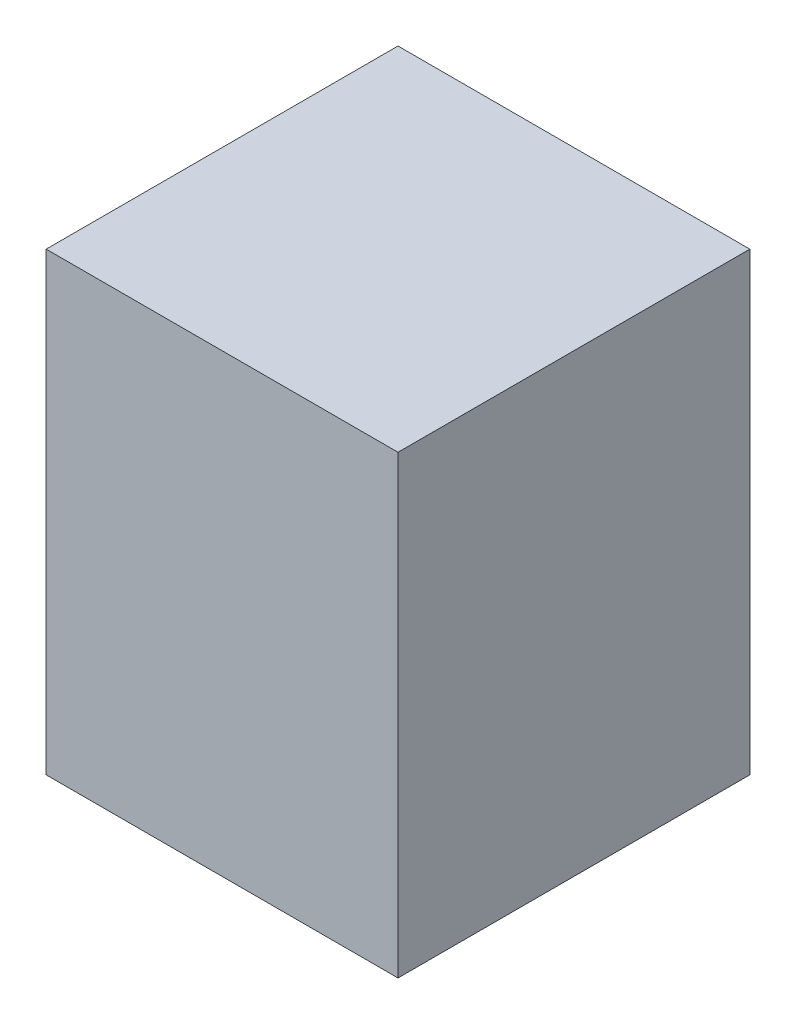
ISO-10303-21;
HEADER;
FILE_DESCRIPTION(('STEP AP214'),'2;1');
FILE_NAME('part.step','',(''),(''),'','','');
FILE_SCHEMA(('AUTOMOTIVE_DESIGN { 1 0 10303 214 1 1 1 1 }'));
ENDSEC;
DATA;
#1=APPLICATION_CONTEXT('core data for automotive mechanical design processes');
#2=APPLICATION_PROTOCOL_DEFINITION('international standard','automotive_design',2000,#1);
#3=PRODUCT_CONTEXT('',#1,'mechanical');
#4=PRODUCT('Part','Part','',(#3));
#5=PRODUCT_RELATED_PRODUCT_CATEGORY('part','',(#4));
#6=PRODUCT_DEFINITION_FORMATION('','',#4);
#7=PRODUCT_DEFINITION_CONTEXT('part definition',#1,'design');
#8=PRODUCT_DEFINITION('design','',#6,#7);
#9=PRODUCT_DEFINITION_SHAPE('','',#8);
#10=(LENGTH_UNIT() NAMED_UNIT(*) SI_UNIT(.MILLI.,.METRE.));
#11=(NAMED_UNIT(*) PLANE_ANGLE_UNIT() SI_UNIT($,.RADIAN.));
#12=(NAMED_UNIT(*) SI_UNIT($,.STERADIAN.) SOLID_ANGLE_UNIT());
#13=UNCERTAINTY_MEASURE_WITH_UNIT(LENGTH_MEASURE(1.E-05),#10,'distance_accuracy_value','');
#14=(GEOMETRIC_REPRESENTATION_CONTEXT(3) GLOBAL_UNCERTAINTY_ASSIGNED_CONTEXT((#13)) GLOBAL_UNIT_ASSIGNED_CONTEXT((#10,
#11,#12)) REPRESENTATION_CONTEXT('',''));
#15=CARTESIAN_POINT('',(0.,0.,0.));
#16=DIRECTION('',(0.,0.,1.));
#17=DIRECTION('',(1.,0.,0.));
#18=AXIS2_PLACEMENT_3D('',#15,#16,#17);
#19=CARTESIAN_POINT('',(0.,0.,0.));
#20=DIRECTION('',(0.,-1.,0.));
#21=DIRECTION('',(0.,0.,-1.));
#22=AXIS2_PLACEMENT_3D('',#19,#20,#21);
#23=PLANE('',#22);
#24=DIRECTION('',(0.,0.,-1.));
#25=VECTOR('',#24,1.);
#26=CARTESIAN_POINT('',(2590.8,0.,2590.8));
#27=LINE('',#26,#25);
#28=CARTESIAN_POINT('',(2590.8,0.,2590.8));
#29=VERTEX_POINT('',#28);
#30=CARTESIAN_POINT('',(2590.8,0.,-2590.8));
#31=VERTEX_POINT('',#30);
#32=EDGE_CURVE('E131',#29,#31,#27,.T.);
#33=ORIENTED_EDGE('',*,*,#32,.F.);
#34=DIRECTION('',(1.,0.,0.));
#35=VECTOR('',#34,1.);
#36=CARTESIAN_POINT('',(-2590.8,0.,2590.8));
#37=LINE('',#36,#35);
#38=CARTESIAN_POINT('',(-2590.8,0.,2590.8));
#39=VERTEX_POINT('',#38);
#40=EDGE_CURVE('E79',#39,#29,#37,.T.);
#41=ORIENTED_EDGE('',*,*,#40,.F.);
#42=DIRECTION('',(0.,0.,1.));
#43=VECTOR('',#42,1.);
#44=CARTESIAN_POINT('',(-2590.8,0.,2590.8));
#45=LINE('',#44,#43);
#46=CARTESIAN_POINT('',(-2590.8,0.,-2590.8));
#47=VERTEX_POINT('',#46);
#48=EDGE_CURVE('E159',#47,#39,#45,.T.);
#49=ORIENTED_EDGE('',*,*,#48,.F.);
#50=DIRECTION('',(-1.,0.,0.));
#51=VECTOR('',#50,1.);
#52=CARTESIAN_POINT('',(-2590.8,0.,-2590.8));
#53=LINE('',#52,#51);
#54=EDGE_CURVE('E135',#31,#47,#53,.T.);
#55=ORIENTED_EDGE('',*,*,#54,.F.);
#56=EDGE_LOOP('',(#33,#41,#49,#55));
#57=FACE_BOUND('',#56,.T.);
#58=DIRECTION('',(1.,0.,0.));
#59=VECTOR('',#58,1.);
#60=CARTESIAN_POINT('',(0.,0.,2286.));
#61=LINE('',#60,#59);
#62=CARTESIAN_POINT('',(-2286.,0.,2286.));
#63=VERTEX_POINT('',#62);
#64=CARTESIAN_POINT('',(2286.,0.,2286.));
#65=VERTEX_POINT('',#64);
#66=EDGE_CURVE('E126',#63,#65,#61,.T.);
#67=ORIENTED_EDGE('',*,*,#66,.T.);
#68=DIRECTION('',(0.,0.,-1.));
#69=VECTOR('',#68,1.);
#70=CARTESIAN_POINT('',(2286.,0.,0.));
#71=LINE('',#70,#69);
#72=CARTESIAN_POINT('',(2286.,0.,-2286.));
#73=VERTEX_POINT('',#72);
#74=EDGE_CURVE('E145',#65,#73,#71,.T.);
#75=ORIENTED_EDGE('',*,*,#74,.T.);
#76=DIRECTION('',(-1.,0.,0.));
#77=VECTOR('',#76,1.);
#78=CARTESIAN_POINT('',(0.,0.,-2286.));
#79=LINE('',#78,#77);
#80=CARTESIAN_POINT('',(-2286.,0.,-2286.));
#81=VERTEX_POINT('',#80);
#82=EDGE_CURVE('E130',#73,#81,#79,.T.);
#83=ORIENTED_EDGE('',*,*,#82,.T.);
#84=DIRECTION('',(0.,0.,1.));
#85=VECTOR('',#84,1.);
#86=CARTESIAN_POINT('',(-2286.,0.,0.));
#87=LINE('',#86,#85);
#88=EDGE_CURVE('E49',#81,#63,#87,.T.);
#89=ORIENTED_EDGE('',*,*,#88,.T.);
#90=EDGE_LOOP('',(#67,#75,#83,#89));
#91=FACE_BOUND('',#90,.T.);
#92=ADVANCED_FACE('F34',(#57,#91),#23,.T.);
#93=CARTESIAN_POINT('',(2590.8,6705.6,2590.8));
#94=DIRECTION('',(-1.,0.,0.));
#95=DIRECTION('',(0.,0.,1.));
#96=AXIS2_PLACEMENT_3D('',#93,#94,#95);
#97=PLANE('',#96);
#98=ORIENTED_EDGE('',*,*,#32,.T.);
#99=DIRECTION('',(0.,-1.,0.));
#100=VECTOR('',#99,1.);
#101=CARTESIAN_POINT('',(2590.8,6705.6,-2590.8));
#102=LINE('',#101,#100);
#103=CARTESIAN_POINT('',(2590.8,6705.6,-2590.8));
#104=VERTEX_POINT('',#103);
#105=EDGE_CURVE('E11',#104,#31,#102,.T.);
#106=ORIENTED_EDGE('',*,*,#105,.F.);
#107=DIRECTION('',(0.,0.,-1.));
#108=VECTOR('',#107,1.);
#109=CARTESIAN_POINT('',(2590.8,6705.6,2590.8));
#110=LINE('',#109,#108);
#111=CARTESIAN_POINT('',(2590.8,6705.6,2590.8));
#112=VERTEX_POINT('',#111);
#113=EDGE_CURVE('E151',#112,#104,#110,.T.);
#114=ORIENTED_EDGE('',*,*,#113,.F.);
#115=DIRECTION('',(0.,-1.,0.));
#116=VECTOR('',#115,1.);
#117=CARTESIAN_POINT('',(2590.8,6705.6,2590.8));
#118=LINE('',#117,#116);
#119=EDGE_CURVE('E156',#112,#29,#118,.T.);
#120=ORIENTED_EDGE('',*,*,#119,.T.);
#121=EDGE_LOOP('',(#98,#106,#114,#120));
#122=FACE_BOUND('',#121,.T.);
#123=ADVANCED_FACE('F36',(#122),#97,.F.);
#124=CARTESIAN_POINT('',(-2590.8,6705.6,-2590.8));
#125=DIRECTION('',(0.,0.,1.));
#126=DIRECTION('',(1.,0.,0.));
#127=AXIS2_PLACEMENT_3D('',#124,#125,#126);
#128=PLANE('',#127);
#129=ORIENTED_EDGE('',*,*,#54,.T.);
#130=DIRECTION('',(0.,-1.,0.));
#131=VECTOR('',#130,1.);
#132=CARTESIAN_POINT('',(-2590.8,6705.6,-2590.8));
#133=LINE('',#132,#131);
#134=CARTESIAN_POINT('',(-2590.8,6705.6,-2590.8));
#135=VERTEX_POINT('',#134);
#136=EDGE_CURVE('E42',#135,#47,#133,.T.);
#137=ORIENTED_EDGE('',*,*,#136,.F.);
#138=DIRECTION('',(-1.,0.,0.));
#139=VECTOR('',#138,1.);
#140=CARTESIAN_POINT('',(-2590.8,6705.6,-2590.8));
#141=LINE('',#140,#139);
#142=EDGE_CURVE('E86',#104,#135,#141,.T.);
#143=ORIENTED_EDGE('',*,*,#142,.F.);
#144=ORIENTED_EDGE('',*,*,#105,.T.);
#145=EDGE_LOOP('',(#129,#137,#143,#144));
#146=FACE_BOUND('',#145,.T.);
#147=ADVANCED_FACE('F185',(#146),#128,.F.);
#148=CARTESIAN_POINT('',(-2590.8,6705.6,2590.8));
#149=DIRECTION('',(1.,0.,0.));
#150=DIRECTION('',(0.,0.,-1.));
#151=AXIS2_PLACEMENT_3D('',#148,#149,#150);
#152=PLANE('',#151);
#153=ORIENTED_EDGE('',*,*,#48,.T.);
#154=DIRECTION('',(0.,-1.,0.));
#155=VECTOR('',#154,1.);
#156=CARTESIAN_POINT('',(-2590.8,6705.6,2590.8));
#157=LINE('',#156,#155);
#158=CARTESIAN_POINT('',(-2590.8,6705.6,2590.8));
#159=VERTEX_POINT('',#158);
#160=EDGE_CURVE('E163',#159,#39,#157,.T.);
#161=ORIENTED_EDGE('',*,*,#160,.F.);
#162=DIRECTION('',(0.,0.,1.));
#163=VECTOR('',#162,1.);
#164=CARTESIAN_POINT('',(-2590.8,6705.6,2590.8));
#165=LINE('',#164,#163);
#166=EDGE_CURVE('E154',#135,#159,#165,.T.);
#167=ORIENTED_EDGE('',*,*,#166,.F.);
#168=ORIENTED_EDGE('',*,*,#136,.T.);
#169=EDGE_LOOP('',(#153,#161,#167,#168));
#170=FACE_BOUND('',#169,.T.);
#171=ADVANCED_FACE('F168',(#170),#152,.F.);
#172=CARTESIAN_POINT('',(-2590.8,6705.6,2590.8));
#173=DIRECTION('',(0.,0.,-1.));
#174=DIRECTION('',(-1.,0.,0.));
#175=AXIS2_PLACEMENT_3D('',#172,#173,#174);
#176=PLANE('',#175);
#177=ORIENTED_EDGE('',*,*,#40,.T.);
#178=ORIENTED_EDGE('',*,*,#119,.F.);
#179=DIRECTION('',(1.,0.,0.));
#180=VECTOR('',#179,1.);
#181=CARTESIAN_POINT('',(-2590.8,6705.6,2590.8));
#182=LINE('',#181,#180);
#183=EDGE_CURVE('E58',#159,#112,#182,.T.);
#184=ORIENTED_EDGE('',*,*,#183,.F.);
#185=ORIENTED_EDGE('',*,*,#160,.T.);
#186=EDGE_LOOP('',(#177,#178,#184,#185));
#187=FACE_BOUND('',#186,.T.);
#188=ADVANCED_FACE('F176',(#187),#176,.F.);
#189=CARTESIAN_POINT('',(0.,6705.6,0.));
#190=DIRECTION('',(0.,-1.,0.));
#191=DIRECTION('',(0.,0.,-1.));
#192=AXIS2_PLACEMENT_3D('',#189,#190,#191);
#193=PLANE('',#192);
#194=ORIENTED_EDGE('',*,*,#113,.T.);
#195=ORIENTED_EDGE('',*,*,#142,.T.);
#196=ORIENTED_EDGE('',*,*,#166,.T.);
#197=ORIENTED_EDGE('',*,*,#183,.T.);
#198=EDGE_LOOP('',(#194,#195,#196,#197));
#199=FACE_BOUND('',#198,.T.);
#200=ADVANCED_FACE('F178',(#199),#193,.F.);
#201=CARTESIAN_POINT('',(2286.,6705.6,2590.8));
#202=DIRECTION('',(-1.,0.,0.));
#203=DIRECTION('',(0.,0.,1.));
#204=AXIS2_PLACEMENT_3D('',#201,#202,#203);
#205=PLANE('',#204);
#206=ORIENTED_EDGE('',*,*,#74,.F.);
#207=DIRECTION('',(0.,-1.,0.));
#208=VECTOR('',#207,1.);
#209=CARTESIAN_POINT('',(2286.,6705.6,2286.));
#210=LINE('',#209,#208);
#211=CARTESIAN_POINT('',(2286.,6400.8,2286.));
#212=VERTEX_POINT('',#211);
#213=EDGE_CURVE('E125',#212,#65,#210,.T.);
#214=ORIENTED_EDGE('',*,*,#213,.F.);
#215=DIRECTION('',(0.,0.,-1.));
#216=VECTOR('',#215,1.);
#217=CARTESIAN_POINT('',(2286.,6400.8,0.));
#218=LINE('',#217,#216);
#219=CARTESIAN_POINT('',(2286.,6400.8,-2286.));
#220=VERTEX_POINT('',#219);
#221=EDGE_CURVE('E113',#212,#220,#218,.T.);
#222=ORIENTED_EDGE('',*,*,#221,.T.);
#223=DIRECTION('',(0.,-1.,0.));
#224=VECTOR('',#223,1.);
#225=CARTESIAN_POINT('',(2286.,6705.6,-2286.));
#226=LINE('',#225,#224);
#227=EDGE_CURVE('E123',#220,#73,#226,.T.);
#228=ORIENTED_EDGE('',*,*,#227,.T.);
#229=EDGE_LOOP('',(#206,#214,#222,#228));
#230=FACE_BOUND('',#229,.T.);
#231=ADVANCED_FACE('F122',(#230),#205,.T.);
#232=CARTESIAN_POINT('',(-2590.8,6705.6,-2286.));
#233=DIRECTION('',(0.,0.,1.));
#234=DIRECTION('',(1.,0.,0.));
#235=AXIS2_PLACEMENT_3D('',#232,#233,#234);
#236=PLANE('',#235);
#237=ORIENTED_EDGE('',*,*,#82,.F.);
#238=ORIENTED_EDGE('',*,*,#227,.F.);
#239=DIRECTION('',(-1.,0.,0.));
#240=VECTOR('',#239,1.);
#241=CARTESIAN_POINT('',(0.,6400.8,-2286.));
#242=LINE('',#241,#240);
#243=CARTESIAN_POINT('',(-2286.,6400.8,-2286.));
#244=VERTEX_POINT('',#243);
#245=EDGE_CURVE('E109',#220,#244,#242,.T.);
#246=ORIENTED_EDGE('',*,*,#245,.T.);
#247=DIRECTION('',(0.,-1.,0.));
#248=VECTOR('',#247,1.);
#249=CARTESIAN_POINT('',(-2286.,6705.6,-2286.));
#250=LINE('',#249,#248);
#251=EDGE_CURVE('E132',#244,#81,#250,.T.);
#252=ORIENTED_EDGE('',*,*,#251,.T.);
#253=EDGE_LOOP('',(#237,#238,#246,#252));
#254=FACE_BOUND('',#253,.T.);
#255=ADVANCED_FACE('F128',(#254),#236,.T.);
#256=CARTESIAN_POINT('',(-2286.,6705.6,2590.8));
#257=DIRECTION('',(1.,0.,0.));
#258=DIRECTION('',(0.,0.,-1.));
#259=AXIS2_PLACEMENT_3D('',#256,#257,#258);
#260=PLANE('',#259);
#261=ORIENTED_EDGE('',*,*,#88,.F.);
#262=ORIENTED_EDGE('',*,*,#251,.F.);
#263=DIRECTION('',(0.,0.,1.));
#264=VECTOR('',#263,1.);
#265=CARTESIAN_POINT('',(-2286.,6400.8,0.));
#266=LINE('',#265,#264);
#267=CARTESIAN_POINT('',(-2286.,6400.8,2286.));
#268=VERTEX_POINT('',#267);
#269=EDGE_CURVE('E114',#244,#268,#266,.T.);
#270=ORIENTED_EDGE('',*,*,#269,.T.);
#271=DIRECTION('',(0.,-1.,0.));
#272=VECTOR('',#271,1.);
#273=CARTESIAN_POINT('',(-2286.,6705.6,2286.));
#274=LINE('',#273,#272);
#275=EDGE_CURVE('E137',#268,#63,#274,.T.);
#276=ORIENTED_EDGE('',*,*,#275,.T.);
#277=EDGE_LOOP('',(#261,#262,#270,#276));
#278=FACE_BOUND('',#277,.T.);
#279=ADVANCED_FACE('F198',(#278),#260,.T.);
#280=CARTESIAN_POINT('',(-2590.8,6705.6,2286.));
#281=DIRECTION('',(0.,0.,-1.));
#282=DIRECTION('',(-1.,0.,0.));
#283=AXIS2_PLACEMENT_3D('',#280,#281,#282);
#284=PLANE('',#283);
#285=ORIENTED_EDGE('',*,*,#66,.F.);
#286=ORIENTED_EDGE('',*,*,#275,.F.);
#287=DIRECTION('',(1.,0.,0.));
#288=VECTOR('',#287,1.);
#289=CARTESIAN_POINT('',(0.,6400.8,2286.));
#290=LINE('',#289,#288);
#291=EDGE_CURVE('E140',#268,#212,#290,.T.);
#292=ORIENTED_EDGE('',*,*,#291,.T.);
#293=ORIENTED_EDGE('',*,*,#213,.T.);
#294=EDGE_LOOP('',(#285,#286,#292,#293));
#295=FACE_BOUND('',#294,.T.);
#296=ADVANCED_FACE('F195',(#295),#284,.T.);
#297=CARTESIAN_POINT('',(0.,6400.8,0.));
#298=DIRECTION('',(0.,-1.,0.));
#299=DIRECTION('',(0.,0.,-1.));
#300=AXIS2_PLACEMENT_3D('',#297,#298,#299);
#301=PLANE('',#300);
#302=ORIENTED_EDGE('',*,*,#221,.F.);
#303=ORIENTED_EDGE('',*,*,#291,.F.);
#304=ORIENTED_EDGE('',*,*,#269,.F.);
#305=ORIENTED_EDGE('',*,*,#245,.F.);
#306=EDGE_LOOP('',(#302,#303,#304,#305));
#307=FACE_BOUND('',#306,.T.);
#308=ADVANCED_FACE('F111',(#307),#301,.T.);
#309=CLOSED_SHELL('',(#92,#123,#147,#171,#188,#200,#231,#255,#279,#296,#308));
#310=MANIFOLD_SOLID_BREP('B2',#309);
#311=ADVANCED_BREP_SHAPE_REPRESENTATION('',(#18,#310),#14);
#312=SHAPE_DEFINITION_REPRESENTATION(#9,#311);
ENDSEC;
END-ISO-10303-21;
